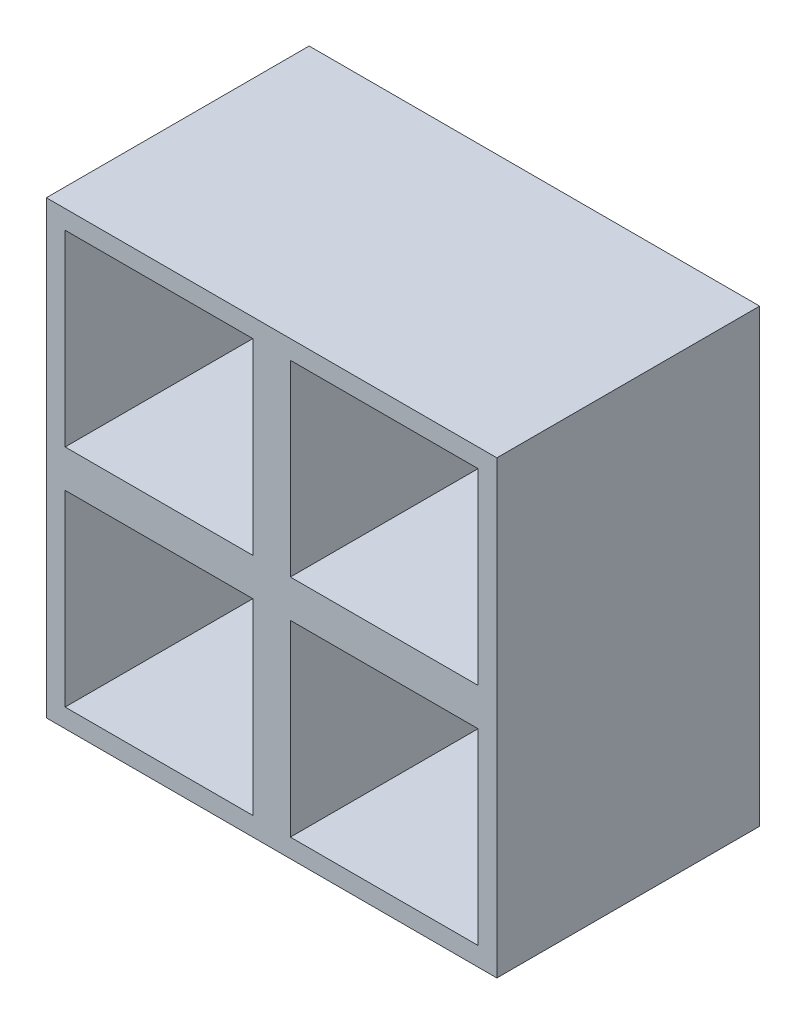
ISO-10303-21;
HEADER;
FILE_DESCRIPTION(('STEP AP214'),'2;1');
FILE_NAME('part.step','',(''),(''),'','','');
FILE_SCHEMA(('AUTOMOTIVE_DESIGN { 1 0 10303 214 1 1 1 1 }'));
ENDSEC;
DATA;
#1=APPLICATION_CONTEXT('core data for automotive mechanical design processes');
#2=APPLICATION_PROTOCOL_DEFINITION('international standard','automotive_design',2000,#1);
#3=PRODUCT_CONTEXT('',#1,'mechanical');
#4=PRODUCT('Part','Part','',(#3));
#5=PRODUCT_RELATED_PRODUCT_CATEGORY('part','',(#4));
#6=PRODUCT_DEFINITION_FORMATION('','',#4);
#7=PRODUCT_DEFINITION_CONTEXT('part definition',#1,'design');
#8=PRODUCT_DEFINITION('design','',#6,#7);
#9=PRODUCT_DEFINITION_SHAPE('','',#8);
#10=(LENGTH_UNIT() NAMED_UNIT(*) SI_UNIT(.MILLI.,.METRE.));
#11=(NAMED_UNIT(*) PLANE_ANGLE_UNIT() SI_UNIT($,.RADIAN.));
#12=(NAMED_UNIT(*) SI_UNIT($,.STERADIAN.) SOLID_ANGLE_UNIT());
#13=UNCERTAINTY_MEASURE_WITH_UNIT(LENGTH_MEASURE(1.E-05),#10,'distance_accuracy_value','');
#14=(GEOMETRIC_REPRESENTATION_CONTEXT(3) GLOBAL_UNCERTAINTY_ASSIGNED_CONTEXT((#13)) GLOBAL_UNIT_ASSIGNED_CONTEXT((#10,
#11,#12)) REPRESENTATION_CONTEXT('',''));
#15=CARTESIAN_POINT('',(0.,0.,0.));
#16=DIRECTION('',(0.,0.,1.));
#17=DIRECTION('',(1.,0.,0.));
#18=AXIS2_PLACEMENT_3D('',#15,#16,#17);
#19=CARTESIAN_POINT('',(-3.,-3.,1.));
#20=DIRECTION('',(1.,0.,0.));
#21=DIRECTION('',(0.,0.,-1.));
#22=AXIS2_PLACEMENT_3D('',#19,#20,#21);
#23=PLANE('',#22);
#24=DIRECTION('',(0.,-1.,0.));
#25=VECTOR('',#24,1.);
#26=CARTESIAN_POINT('',(-3.,-3.,0.));
#27=LINE('',#26,#25);
#28=CARTESIAN_POINT('',(-3.,3.,0.));
#29=VERTEX_POINT('',#28);
#30=CARTESIAN_POINT('',(-3.,-3.,0.));
#31=VERTEX_POINT('',#30);
#32=EDGE_CURVE('E295',#29,#31,#27,.T.);
#33=ORIENTED_EDGE('',*,*,#32,.T.);
#34=DIRECTION('',(0.,0.,-1.));
#35=VECTOR('',#34,1.);
#36=CARTESIAN_POINT('',(-3.,-3.,1.));
#37=LINE('',#36,#35);
#38=CARTESIAN_POINT('',(-3.,-3.,3.5));
#39=VERTEX_POINT('',#38);
#40=EDGE_CURVE('E11',#39,#31,#37,.T.);
#41=ORIENTED_EDGE('',*,*,#40,.F.);
#42=DIRECTION('',(0.,1.,0.));
#43=VECTOR('',#42,1.);
#44=CARTESIAN_POINT('',(-3.,0.,3.5));
#45=LINE('',#44,#43);
#46=CARTESIAN_POINT('',(-3.,3.,3.5));
#47=VERTEX_POINT('',#46);
#48=EDGE_CURVE('E219',#39,#47,#45,.T.);
#49=ORIENTED_EDGE('',*,*,#48,.T.);
#50=DIRECTION('',(0.,0.,-1.));
#51=VECTOR('',#50,1.);
#52=CARTESIAN_POINT('',(-3.,3.,1.));
#53=LINE('',#52,#51);
#54=EDGE_CURVE('E325',#47,#29,#53,.T.);
#55=ORIENTED_EDGE('',*,*,#54,.T.);
#56=EDGE_LOOP('',(#33,#41,#49,#55));
#57=FACE_BOUND('',#56,.T.);
#58=ADVANCED_FACE('F35',(#57),#23,.F.);
#59=CARTESIAN_POINT('',(3.,-3.,1.));
#60=DIRECTION('',(0.,1.,0.));
#61=DIRECTION('',(-1.,0.,0.));
#62=AXIS2_PLACEMENT_3D('',#59,#60,#61);
#63=PLANE('',#62);
#64=DIRECTION('',(1.,0.,0.));
#65=VECTOR('',#64,1.);
#66=CARTESIAN_POINT('',(3.,-3.,0.));
#67=LINE('',#66,#65);
#68=CARTESIAN_POINT('',(3.,-3.,0.));
#69=VERTEX_POINT('',#68);
#70=EDGE_CURVE('E319',#31,#69,#67,.T.);
#71=ORIENTED_EDGE('',*,*,#70,.T.);
#72=DIRECTION('',(0.,0.,-1.));
#73=VECTOR('',#72,1.);
#74=CARTESIAN_POINT('',(3.,-3.,1.));
#75=LINE('',#74,#73);
#76=CARTESIAN_POINT('',(3.,-3.,3.5));
#77=VERTEX_POINT('',#76);
#78=EDGE_CURVE('E42',#77,#69,#75,.T.);
#79=ORIENTED_EDGE('',*,*,#78,.F.);
#80=DIRECTION('',(-1.,0.,0.));
#81=VECTOR('',#80,1.);
#82=CARTESIAN_POINT('',(0.,-3.,3.5));
#83=LINE('',#82,#81);
#84=EDGE_CURVE('E222',#77,#39,#83,.T.);
#85=ORIENTED_EDGE('',*,*,#84,.T.);
#86=ORIENTED_EDGE('',*,*,#40,.T.);
#87=EDGE_LOOP('',(#71,#79,#85,#86));
#88=FACE_BOUND('',#87,.T.);
#89=ADVANCED_FACE('F348',(#88),#63,.F.);
#90=CARTESIAN_POINT('',(3.,-3.,1.));
#91=DIRECTION('',(-1.,0.,0.));
#92=DIRECTION('',(0.,0.,1.));
#93=AXIS2_PLACEMENT_3D('',#90,#91,#92);
#94=PLANE('',#93);
#95=DIRECTION('',(0.,1.,0.));
#96=VECTOR('',#95,1.);
#97=CARTESIAN_POINT('',(3.,-3.,0.));
#98=LINE('',#97,#96);
#99=CARTESIAN_POINT('',(3.,3.,0.));
#100=VERTEX_POINT('',#99);
#101=EDGE_CURVE('E321',#69,#100,#98,.T.);
#102=ORIENTED_EDGE('',*,*,#101,.T.);
#103=DIRECTION('',(0.,0.,-1.));
#104=VECTOR('',#103,1.);
#105=CARTESIAN_POINT('',(3.,3.,1.));
#106=LINE('',#105,#104);
#107=CARTESIAN_POINT('',(3.,3.,3.5));
#108=VERTEX_POINT('',#107);
#109=EDGE_CURVE('E328',#108,#100,#106,.T.);
#110=ORIENTED_EDGE('',*,*,#109,.F.);
#111=DIRECTION('',(0.,1.,0.));
#112=VECTOR('',#111,1.);
#113=CARTESIAN_POINT('',(3.,0.,3.5));
#114=LINE('',#113,#112);
#115=EDGE_CURVE('E213',#77,#108,#114,.T.);
#116=ORIENTED_EDGE('',*,*,#115,.F.);
#117=ORIENTED_EDGE('',*,*,#78,.T.);
#118=EDGE_LOOP('',(#102,#110,#116,#117));
#119=FACE_BOUND('',#118,.T.);
#120=ADVANCED_FACE('F334',(#119),#94,.F.);
#121=CARTESIAN_POINT('',(3.,3.,1.));
#122=DIRECTION('',(0.,-1.,0.));
#123=DIRECTION('',(1.,0.,0.));
#124=AXIS2_PLACEMENT_3D('',#121,#122,#123);
#125=PLANE('',#124);
#126=DIRECTION('',(-1.,0.,0.));
#127=VECTOR('',#126,1.);
#128=CARTESIAN_POINT('',(3.,3.,0.));
#129=LINE('',#128,#127);
#130=EDGE_CURVE('E323',#100,#29,#129,.T.);
#131=ORIENTED_EDGE('',*,*,#130,.T.);
#132=ORIENTED_EDGE('',*,*,#54,.F.);
#133=DIRECTION('',(-1.,0.,0.));
#134=VECTOR('',#133,1.);
#135=CARTESIAN_POINT('',(0.,3.,3.5));
#136=LINE('',#135,#134);
#137=EDGE_CURVE('E216',#108,#47,#136,.T.);
#138=ORIENTED_EDGE('',*,*,#137,.F.);
#139=ORIENTED_EDGE('',*,*,#109,.T.);
#140=EDGE_LOOP('',(#131,#132,#138,#139));
#141=FACE_BOUND('',#140,.T.);
#142=ADVANCED_FACE('F342',(#141),#125,.F.);
#143=CARTESIAN_POINT('',(0.,0.,0.));
#144=DIRECTION('',(0.,0.,1.));
#145=DIRECTION('',(1.,0.,0.));
#146=AXIS2_PLACEMENT_3D('',#143,#144,#145);
#147=PLANE('',#146);
#148=ORIENTED_EDGE('',*,*,#32,.F.);
#149=ORIENTED_EDGE('',*,*,#130,.F.);
#150=ORIENTED_EDGE('',*,*,#101,.F.);
#151=ORIENTED_EDGE('',*,*,#70,.F.);
#152=EDGE_LOOP('',(#148,#149,#150,#151));
#153=FACE_BOUND('',#152,.T.);
#154=ADVANCED_FACE('F340',(#153),#147,.F.);
#155=CARTESIAN_POINT('',(0.25,0.,3.5));
#156=DIRECTION('',(1.,0.,0.));
#157=DIRECTION('',(0.,1.,0.));
#158=AXIS2_PLACEMENT_3D('',#155,#156,#157);
#159=PLANE('',#158);
#160=DIRECTION('',(0.,-1.,0.));
#161=VECTOR('',#160,1.);
#162=CARTESIAN_POINT('',(0.25,0.,1.));
#163=LINE('',#162,#161);
#164=CARTESIAN_POINT('',(0.25,2.75,1.));
#165=VERTEX_POINT('',#164);
#166=CARTESIAN_POINT('',(0.25,0.25,1.));
#167=VERTEX_POINT('',#166);
#168=EDGE_CURVE('E276',#165,#167,#163,.T.);
#169=ORIENTED_EDGE('',*,*,#168,.F.);
#170=DIRECTION('',(0.,0.,-1.));
#171=VECTOR('',#170,1.);
#172=CARTESIAN_POINT('',(0.25,2.75,3.5));
#173=LINE('',#172,#171);
#174=CARTESIAN_POINT('',(0.25,2.75,3.5));
#175=VERTEX_POINT('',#174);
#176=EDGE_CURVE('E292',#175,#165,#173,.T.);
#177=ORIENTED_EDGE('',*,*,#176,.F.);
#178=DIRECTION('',(0.,-1.,0.));
#179=VECTOR('',#178,1.);
#180=CARTESIAN_POINT('',(0.25,0.,3.5));
#181=LINE('',#180,#179);
#182=CARTESIAN_POINT('',(0.25,0.25,3.5));
#183=VERTEX_POINT('',#182);
#184=EDGE_CURVE('E236',#175,#183,#181,.T.);
#185=ORIENTED_EDGE('',*,*,#184,.T.);
#186=DIRECTION('',(0.,0.,-1.));
#187=VECTOR('',#186,1.);
#188=CARTESIAN_POINT('',(0.25,0.25,3.5));
#189=LINE('',#188,#187);
#190=EDGE_CURVE('E282',#183,#167,#189,.T.);
#191=ORIENTED_EDGE('',*,*,#190,.T.);
#192=EDGE_LOOP('',(#169,#177,#185,#191));
#193=FACE_BOUND('',#192,.T.);
#194=ADVANCED_FACE('F360',(#193),#159,.T.);
#195=CARTESIAN_POINT('',(0.,2.75,3.5));
#196=DIRECTION('',(0.,1.,0.));
#197=DIRECTION('',(0.,0.,1.));
#198=AXIS2_PLACEMENT_3D('',#195,#196,#197);
#199=PLANE('',#198);
#200=DIRECTION('',(1.,0.,0.));
#201=VECTOR('',#200,1.);
#202=CARTESIAN_POINT('',(0.,2.75,1.));
#203=LINE('',#202,#201);
#204=CARTESIAN_POINT('',(2.75,2.75,1.));
#205=VERTEX_POINT('',#204);
#206=EDGE_CURVE('E278',#165,#205,#203,.T.);
#207=ORIENTED_EDGE('',*,*,#206,.T.);
#208=DIRECTION('',(0.,0.,-1.));
#209=VECTOR('',#208,1.);
#210=CARTESIAN_POINT('',(2.75,2.75,3.5));
#211=LINE('',#210,#209);
#212=CARTESIAN_POINT('',(2.75,2.75,3.5));
#213=VERTEX_POINT('',#212);
#214=EDGE_CURVE('E289',#213,#205,#211,.T.);
#215=ORIENTED_EDGE('',*,*,#214,.F.);
#216=DIRECTION('',(1.,0.,0.));
#217=VECTOR('',#216,1.);
#218=CARTESIAN_POINT('',(0.,2.75,3.5));
#219=LINE('',#218,#217);
#220=EDGE_CURVE('E239',#175,#213,#219,.T.);
#221=ORIENTED_EDGE('',*,*,#220,.F.);
#222=ORIENTED_EDGE('',*,*,#176,.T.);
#223=EDGE_LOOP('',(#207,#215,#221,#222));
#224=FACE_BOUND('',#223,.T.);
#225=ADVANCED_FACE('F415',(#224),#199,.F.);
#226=CARTESIAN_POINT('',(2.75,0.,3.5));
#227=DIRECTION('',(-1.,0.,0.));
#228=DIRECTION('',(0.,0.,1.));
#229=AXIS2_PLACEMENT_3D('',#226,#227,#228);
#230=PLANE('',#229);
#231=DIRECTION('',(0.,1.,0.));
#232=VECTOR('',#231,1.);
#233=CARTESIAN_POINT('',(2.75,0.,1.));
#234=LINE('',#233,#232);
#235=CARTESIAN_POINT('',(2.75,0.25,1.));
#236=VERTEX_POINT('',#235);
#237=EDGE_CURVE('E197',#236,#205,#234,.T.);
#238=ORIENTED_EDGE('',*,*,#237,.F.);
#239=DIRECTION('',(0.,0.,-1.));
#240=VECTOR('',#239,1.);
#241=CARTESIAN_POINT('',(2.75,0.25,3.5));
#242=LINE('',#241,#240);
#243=CARTESIAN_POINT('',(2.75,0.25,3.5));
#244=VERTEX_POINT('',#243);
#245=EDGE_CURVE('E285',#244,#236,#242,.T.);
#246=ORIENTED_EDGE('',*,*,#245,.F.);
#247=DIRECTION('',(0.,1.,0.));
#248=VECTOR('',#247,1.);
#249=CARTESIAN_POINT('',(2.75,0.,3.5));
#250=LINE('',#249,#248);
#251=EDGE_CURVE('E241',#244,#213,#250,.T.);
#252=ORIENTED_EDGE('',*,*,#251,.T.);
#253=ORIENTED_EDGE('',*,*,#214,.T.);
#254=EDGE_LOOP('',(#238,#246,#252,#253));
#255=FACE_BOUND('',#254,.T.);
#256=ADVANCED_FACE('F402',(#255),#230,.T.);
#257=CARTESIAN_POINT('',(0.,0.25,3.5));
#258=DIRECTION('',(0.,-1.,0.));
#259=DIRECTION('',(1.,0.,0.));
#260=AXIS2_PLACEMENT_3D('',#257,#258,#259);
#261=PLANE('',#260);
#262=DIRECTION('',(-1.,0.,0.));
#263=VECTOR('',#262,1.);
#264=CARTESIAN_POINT('',(0.,0.25,1.));
#265=LINE('',#264,#263);
#266=CARTESIAN_POINT('',(-0.25,0.25,1.));
#267=VERTEX_POINT('',#266);
#268=CARTESIAN_POINT('',(-2.75,0.25,1.));
#269=VERTEX_POINT('',#268);
#270=EDGE_CURVE('E269',#267,#269,#265,.T.);
#271=ORIENTED_EDGE('',*,*,#270,.T.);
#272=DIRECTION('',(0.,0.,-1.));
#273=VECTOR('',#272,1.);
#274=CARTESIAN_POINT('',(-2.75,0.25,3.5));
#275=LINE('',#274,#273);
#276=CARTESIAN_POINT('',(-2.75,0.25,3.5));
#277=VERTEX_POINT('',#276);
#278=EDGE_CURVE('E286',#277,#269,#275,.T.);
#279=ORIENTED_EDGE('',*,*,#278,.F.);
#280=DIRECTION('',(-1.,0.,0.));
#281=VECTOR('',#280,1.);
#282=CARTESIAN_POINT('',(0.,0.25,3.5));
#283=LINE('',#282,#281);
#284=CARTESIAN_POINT('',(-0.25,0.25,3.5));
#285=VERTEX_POINT('',#284);
#286=EDGE_CURVE('E225',#285,#277,#283,.T.);
#287=ORIENTED_EDGE('',*,*,#286,.F.);
#288=DIRECTION('',(0.,0.,-1.));
#289=VECTOR('',#288,1.);
#290=CARTESIAN_POINT('',(-0.25,0.25,3.5));
#291=LINE('',#290,#289);
#292=EDGE_CURVE('E296',#285,#267,#291,.T.);
#293=ORIENTED_EDGE('',*,*,#292,.T.);
#294=EDGE_LOOP('',(#271,#279,#287,#293));
#295=FACE_BOUND('',#294,.T.);
#296=ADVANCED_FACE('F398',(#295),#261,.F.);
#297=CARTESIAN_POINT('',(-2.75,0.,3.5));
#298=DIRECTION('',(-1.,0.,0.));
#299=DIRECTION('',(0.,0.,1.));
#300=AXIS2_PLACEMENT_3D('',#297,#298,#299);
#301=PLANE('',#300);
#302=DIRECTION('',(0.,1.,0.));
#303=VECTOR('',#302,1.);
#304=CARTESIAN_POINT('',(-2.75,0.,1.));
#305=LINE('',#304,#303);
#306=CARTESIAN_POINT('',(-2.75,2.75,1.));
#307=VERTEX_POINT('',#306);
#308=EDGE_CURVE('E49',#269,#307,#305,.T.);
#309=ORIENTED_EDGE('',*,*,#308,.T.);
#310=DIRECTION('',(0.,0.,-1.));
#311=VECTOR('',#310,1.);
#312=CARTESIAN_POINT('',(-2.75,2.75,3.5));
#313=LINE('',#312,#311);
#314=CARTESIAN_POINT('',(-2.75,2.75,3.5));
#315=VERTEX_POINT('',#314);
#316=EDGE_CURVE('E303',#315,#307,#313,.T.);
#317=ORIENTED_EDGE('',*,*,#316,.F.);
#318=DIRECTION('',(0.,1.,0.));
#319=VECTOR('',#318,1.);
#320=CARTESIAN_POINT('',(-2.75,0.,3.5));
#321=LINE('',#320,#319);
#322=EDGE_CURVE('E228',#277,#315,#321,.T.);
#323=ORIENTED_EDGE('',*,*,#322,.F.);
#324=ORIENTED_EDGE('',*,*,#278,.T.);
#325=EDGE_LOOP('',(#309,#317,#323,#324));
#326=FACE_BOUND('',#325,.T.);
#327=ADVANCED_FACE('F401',(#326),#301,.F.);
#328=CARTESIAN_POINT('',(0.,2.75,3.5));
#329=DIRECTION('',(0.,-1.,0.));
#330=DIRECTION('',(0.,0.,-1.));
#331=AXIS2_PLACEMENT_3D('',#328,#329,#330);
#332=PLANE('',#331);
#333=DIRECTION('',(-1.,0.,0.));
#334=VECTOR('',#333,1.);
#335=CARTESIAN_POINT('',(0.,2.75,1.));
#336=LINE('',#335,#334);
#337=CARTESIAN_POINT('',(-0.25,2.75,1.));
#338=VERTEX_POINT('',#337);
#339=EDGE_CURVE('E54',#338,#307,#336,.T.);
#340=ORIENTED_EDGE('',*,*,#339,.F.);
#341=DIRECTION('',(0.,0.,-1.));
#342=VECTOR('',#341,1.);
#343=CARTESIAN_POINT('',(-0.25,2.75,3.5));
#344=LINE('',#343,#342);
#345=CARTESIAN_POINT('',(-0.25,2.75,3.5));
#346=VERTEX_POINT('',#345);
#347=EDGE_CURVE('E299',#346,#338,#344,.T.);
#348=ORIENTED_EDGE('',*,*,#347,.F.);
#349=DIRECTION('',(-1.,0.,0.));
#350=VECTOR('',#349,1.);
#351=CARTESIAN_POINT('',(0.,2.75,3.5));
#352=LINE('',#351,#350);
#353=EDGE_CURVE('E230',#346,#315,#352,.T.);
#354=ORIENTED_EDGE('',*,*,#353,.T.);
#355=ORIENTED_EDGE('',*,*,#316,.T.);
#356=EDGE_LOOP('',(#340,#348,#354,#355));
#357=FACE_BOUND('',#356,.T.);
#358=ADVANCED_FACE('F387',(#357),#332,.T.);
#359=CARTESIAN_POINT('',(0.,-2.75,3.5));
#360=DIRECTION('',(0.,1.,0.));
#361=DIRECTION('',(0.,0.,1.));
#362=AXIS2_PLACEMENT_3D('',#359,#360,#361);
#363=PLANE('',#362);
#364=DIRECTION('',(1.,0.,0.));
#365=VECTOR('',#364,1.);
#366=CARTESIAN_POINT('',(0.,-2.75,1.));
#367=LINE('',#366,#365);
#368=CARTESIAN_POINT('',(0.25,-2.75,1.));
#369=VERTEX_POINT('',#368);
#370=CARTESIAN_POINT('',(2.75,-2.75,1.));
#371=VERTEX_POINT('',#370);
#372=EDGE_CURVE('E257',#369,#371,#367,.T.);
#373=ORIENTED_EDGE('',*,*,#372,.F.);
#374=DIRECTION('',(0.,0.,-1.));
#375=VECTOR('',#374,1.);
#376=CARTESIAN_POINT('',(0.25,-2.75,3.5));
#377=LINE('',#376,#375);
#378=CARTESIAN_POINT('',(0.25,-2.75,3.5));
#379=VERTEX_POINT('',#378);
#380=EDGE_CURVE('E300',#379,#369,#377,.T.);
#381=ORIENTED_EDGE('',*,*,#380,.F.);
#382=DIRECTION('',(1.,0.,0.));
#383=VECTOR('',#382,1.);
#384=CARTESIAN_POINT('',(0.,-2.75,3.5));
#385=LINE('',#384,#383);
#386=CARTESIAN_POINT('',(2.75,-2.75,3.5));
#387=VERTEX_POINT('',#386);
#388=EDGE_CURVE('E202',#379,#387,#385,.T.);
#389=ORIENTED_EDGE('',*,*,#388,.T.);
#390=DIRECTION('',(0.,0.,-1.));
#391=VECTOR('',#390,1.);
#392=CARTESIAN_POINT('',(2.75,-2.75,3.5));
#393=LINE('',#392,#391);
#394=EDGE_CURVE('E179',#387,#371,#393,.T.);
#395=ORIENTED_EDGE('',*,*,#394,.T.);
#396=EDGE_LOOP('',(#373,#381,#389,#395));
#397=FACE_BOUND('',#396,.T.);
#398=ADVANCED_FACE('F383',(#397),#363,.T.);
#399=CARTESIAN_POINT('',(0.250000000000001,0.,3.5));
#400=DIRECTION('',(1.,0.,0.));
#401=DIRECTION('',(0.,1.,0.));
#402=AXIS2_PLACEMENT_3D('',#399,#400,#401);
#403=PLANE('',#402);
#404=DIRECTION('',(0.,-1.,0.));
#405=VECTOR('',#404,1.);
#406=CARTESIAN_POINT('',(0.250000000000001,0.,1.));
#407=LINE('',#406,#405);
#408=CARTESIAN_POINT('',(0.250000000000001,-0.250000000000001,1.));
#409=VERTEX_POINT('',#408);
#410=EDGE_CURVE('E260',#409,#369,#407,.T.);
#411=ORIENTED_EDGE('',*,*,#410,.F.);
#412=DIRECTION('',(0.,0.,-1.));
#413=VECTOR('',#412,1.);
#414=CARTESIAN_POINT('',(0.250000000000001,-0.250000000000001,3.5));
#415=LINE('',#414,#413);
#416=CARTESIAN_POINT('',(0.250000000000001,-0.250000000000001,3.5));
#417=VERTEX_POINT('',#416);
#418=EDGE_CURVE('E310',#417,#409,#415,.T.);
#419=ORIENTED_EDGE('',*,*,#418,.F.);
#420=DIRECTION('',(0.,-1.,0.));
#421=VECTOR('',#420,1.);
#422=CARTESIAN_POINT('',(0.250000000000001,0.,3.5));
#423=LINE('',#422,#421);
#424=EDGE_CURVE('E205',#417,#379,#423,.T.);
#425=ORIENTED_EDGE('',*,*,#424,.T.);
#426=ORIENTED_EDGE('',*,*,#380,.T.);
#427=EDGE_LOOP('',(#411,#419,#425,#426));
#428=FACE_BOUND('',#427,.T.);
#429=ADVANCED_FACE('F386',(#428),#403,.T.);
#430=CARTESIAN_POINT('',(0.,-0.250000000000001,3.5));
#431=DIRECTION('',(0.,-1.,0.));
#432=DIRECTION('',(1.,0.,0.));
#433=AXIS2_PLACEMENT_3D('',#430,#431,#432);
#434=PLANE('',#433);
#435=DIRECTION('',(-1.,0.,0.));
#436=VECTOR('',#435,1.);
#437=CARTESIAN_POINT('',(0.,-0.250000000000001,1.));
#438=LINE('',#437,#436);
#439=CARTESIAN_POINT('',(2.75,-0.25,1.));
#440=VERTEX_POINT('',#439);
#441=EDGE_CURVE('E263',#440,#409,#438,.T.);
#442=ORIENTED_EDGE('',*,*,#441,.F.);
#443=DIRECTION('',(0.,0.,-1.));
#444=VECTOR('',#443,1.);
#445=CARTESIAN_POINT('',(2.75,-0.25,3.5));
#446=LINE('',#445,#444);
#447=CARTESIAN_POINT('',(2.75,-0.25,3.5));
#448=VERTEX_POINT('',#447);
#449=EDGE_CURVE('E307',#448,#440,#446,.T.);
#450=ORIENTED_EDGE('',*,*,#449,.F.);
#451=DIRECTION('',(-1.,0.,0.));
#452=VECTOR('',#451,1.);
#453=CARTESIAN_POINT('',(0.,-0.250000000000001,3.5));
#454=LINE('',#453,#452);
#455=EDGE_CURVE('E208',#448,#417,#454,.T.);
#456=ORIENTED_EDGE('',*,*,#455,.T.);
#457=ORIENTED_EDGE('',*,*,#418,.T.);
#458=EDGE_LOOP('',(#442,#450,#456,#457));
#459=FACE_BOUND('',#458,.T.);
#460=ADVANCED_FACE('F369',(#459),#434,.T.);
#461=CARTESIAN_POINT('',(-2.75,0.,3.5));
#462=DIRECTION('',(1.,0.,0.));
#463=DIRECTION('',(0.,0.,-1.));
#464=AXIS2_PLACEMENT_3D('',#461,#462,#463);
#465=PLANE('',#464);
#466=DIRECTION('',(0.,-1.,0.));
#467=VECTOR('',#466,1.);
#468=CARTESIAN_POINT('',(-2.75,0.,1.));
#469=LINE('',#468,#467);
#470=CARTESIAN_POINT('',(-2.75,-0.25,1.));
#471=VERTEX_POINT('',#470);
#472=CARTESIAN_POINT('',(-2.75,-2.75,1.));
#473=VERTEX_POINT('',#472);
#474=EDGE_CURVE('E176',#471,#473,#469,.T.);
#475=ORIENTED_EDGE('',*,*,#474,.F.);
#476=DIRECTION('',(0.,0.,-1.));
#477=VECTOR('',#476,1.);
#478=CARTESIAN_POINT('',(-2.75,-0.25,3.5));
#479=LINE('',#478,#477);
#480=CARTESIAN_POINT('',(-2.75,-0.25,3.5));
#481=VERTEX_POINT('',#480);
#482=EDGE_CURVE('E170',#481,#471,#479,.T.);
#483=ORIENTED_EDGE('',*,*,#482,.F.);
#484=DIRECTION('',(0.,-1.,0.));
#485=VECTOR('',#484,1.);
#486=CARTESIAN_POINT('',(-2.75,0.,3.5));
#487=LINE('',#486,#485);
#488=CARTESIAN_POINT('',(-2.75,-2.75,3.5));
#489=VERTEX_POINT('',#488);
#490=EDGE_CURVE('E174',#481,#489,#487,.T.);
#491=ORIENTED_EDGE('',*,*,#490,.T.);
#492=DIRECTION('',(0.,0.,-1.));
#493=VECTOR('',#492,1.);
#494=CARTESIAN_POINT('',(-2.75,-2.75,3.5));
#495=LINE('',#494,#493);
#496=EDGE_CURVE('E247',#489,#473,#495,.T.);
#497=ORIENTED_EDGE('',*,*,#496,.T.);
#498=EDGE_LOOP('',(#475,#483,#491,#497));
#499=FACE_BOUND('',#498,.T.);
#500=ADVANCED_FACE('F172',(#499),#465,.T.);
#501=CARTESIAN_POINT('',(0.,-0.250000000000001,3.5));
#502=DIRECTION('',(0.,1.,0.));
#503=DIRECTION('',(-1.,0.,0.));
#504=AXIS2_PLACEMENT_3D('',#501,#502,#503);
#505=PLANE('',#504);
#506=DIRECTION('',(1.,0.,0.));
#507=VECTOR('',#506,1.);
#508=CARTESIAN_POINT('',(0.,-0.250000000000001,1.));
#509=LINE('',#508,#507);
#510=CARTESIAN_POINT('',(-0.250000000000001,-0.250000000000001,1.));
#511=VERTEX_POINT('',#510);
#512=EDGE_CURVE('E249',#471,#511,#509,.T.);
#513=ORIENTED_EDGE('',*,*,#512,.T.);
#514=DIRECTION('',(0.,0.,-1.));
#515=VECTOR('',#514,1.);
#516=CARTESIAN_POINT('',(-0.250000000000001,-0.250000000000001,3.5));
#517=LINE('',#516,#515);
#518=CARTESIAN_POINT('',(-0.250000000000001,-0.250000000000001,3.5));
#519=VERTEX_POINT('',#518);
#520=EDGE_CURVE('E180',#519,#511,#517,.T.);
#521=ORIENTED_EDGE('',*,*,#520,.F.);
#522=DIRECTION('',(1.,0.,0.));
#523=VECTOR('',#522,1.);
#524=CARTESIAN_POINT('',(0.,-0.250000000000001,3.5));
#525=LINE('',#524,#523);
#526=EDGE_CURVE('E183',#481,#519,#525,.T.);
#527=ORIENTED_EDGE('',*,*,#526,.F.);
#528=ORIENTED_EDGE('',*,*,#482,.T.);
#529=EDGE_LOOP('',(#513,#521,#527,#528));
#530=FACE_BOUND('',#529,.T.);
#531=ADVANCED_FACE('F184',(#530),#505,.F.);
#532=CARTESIAN_POINT('',(-0.250000000000001,0.,3.5));
#533=DIRECTION('',(1.,0.,0.));
#534=DIRECTION('',(0.,1.,0.));
#535=AXIS2_PLACEMENT_3D('',#532,#533,#534);
#536=PLANE('',#535);
#537=DIRECTION('',(0.,-1.,0.));
#538=VECTOR('',#537,1.);
#539=CARTESIAN_POINT('',(-0.250000000000001,0.,1.));
#540=LINE('',#539,#538);
#541=CARTESIAN_POINT('',(-0.25,-2.75,1.));
#542=VERTEX_POINT('',#541);
#543=EDGE_CURVE('E251',#511,#542,#540,.T.);
#544=ORIENTED_EDGE('',*,*,#543,.T.);
#545=DIRECTION('',(0.,0.,-1.));
#546=VECTOR('',#545,1.);
#547=CARTESIAN_POINT('',(-0.25,-2.75,3.5));
#548=LINE('',#547,#546);
#549=CARTESIAN_POINT('',(-0.25,-2.75,3.5));
#550=VERTEX_POINT('',#549);
#551=EDGE_CURVE('E314',#550,#542,#548,.T.);
#552=ORIENTED_EDGE('',*,*,#551,.F.);
#553=DIRECTION('',(0.,-1.,0.));
#554=VECTOR('',#553,1.);
#555=CARTESIAN_POINT('',(-0.250000000000001,0.,3.5));
#556=LINE('',#555,#554);
#557=EDGE_CURVE('E188',#519,#550,#556,.T.);
#558=ORIENTED_EDGE('',*,*,#557,.F.);
#559=ORIENTED_EDGE('',*,*,#520,.T.);
#560=EDGE_LOOP('',(#544,#552,#558,#559));
#561=FACE_BOUND('',#560,.T.);
#562=ADVANCED_FACE('F372',(#561),#536,.F.);
#563=CARTESIAN_POINT('',(-0.25,0.,3.5));
#564=DIRECTION('',(-1.,0.,0.));
#565=DIRECTION('',(0.,-1.,0.));
#566=AXIS2_PLACEMENT_3D('',#563,#564,#565);
#567=PLANE('',#566);
#568=DIRECTION('',(0.,1.,0.));
#569=VECTOR('',#568,1.);
#570=CARTESIAN_POINT('',(-0.25,0.,1.));
#571=LINE('',#570,#569);
#572=EDGE_CURVE('E274',#267,#338,#571,.T.);
#573=ORIENTED_EDGE('',*,*,#572,.F.);
#574=ORIENTED_EDGE('',*,*,#292,.F.);
#575=DIRECTION('',(0.,1.,0.));
#576=VECTOR('',#575,1.);
#577=CARTESIAN_POINT('',(-0.25,0.,3.5));
#578=LINE('',#577,#576);
#579=EDGE_CURVE('E233',#285,#346,#578,.T.);
#580=ORIENTED_EDGE('',*,*,#579,.T.);
#581=ORIENTED_EDGE('',*,*,#347,.T.);
#582=EDGE_LOOP('',(#573,#574,#580,#581));
#583=FACE_BOUND('',#582,.T.);
#584=ADVANCED_FACE('F375',(#583),#567,.T.);
#585=CARTESIAN_POINT('',(2.75,0.,3.5));
#586=DIRECTION('',(1.,0.,0.));
#587=DIRECTION('',(0.,0.,-1.));
#588=AXIS2_PLACEMENT_3D('',#585,#586,#587);
#589=PLANE('',#588);
#590=DIRECTION('',(0.,-1.,0.));
#591=VECTOR('',#590,1.);
#592=CARTESIAN_POINT('',(2.75,0.,1.));
#593=LINE('',#592,#591);
#594=EDGE_CURVE('E266',#440,#371,#593,.T.);
#595=ORIENTED_EDGE('',*,*,#594,.T.);
#596=ORIENTED_EDGE('',*,*,#394,.F.);
#597=DIRECTION('',(0.,-1.,0.));
#598=VECTOR('',#597,1.);
#599=CARTESIAN_POINT('',(2.75,0.,3.5));
#600=LINE('',#599,#598);
#601=EDGE_CURVE('E211',#448,#387,#600,.T.);
#602=ORIENTED_EDGE('',*,*,#601,.F.);
#603=ORIENTED_EDGE('',*,*,#449,.T.);
#604=EDGE_LOOP('',(#595,#596,#602,#603));
#605=FACE_BOUND('',#604,.T.);
#606=ADVANCED_FACE('F381',(#605),#589,.F.);
#607=CARTESIAN_POINT('',(0.,-2.75,3.5));
#608=DIRECTION('',(0.,-1.,0.));
#609=DIRECTION('',(0.,0.,-1.));
#610=AXIS2_PLACEMENT_3D('',#607,#608,#609);
#611=PLANE('',#610);
#612=DIRECTION('',(-1.,0.,0.));
#613=VECTOR('',#612,1.);
#614=CARTESIAN_POINT('',(0.,-2.75,1.));
#615=LINE('',#614,#613);
#616=EDGE_CURVE('E254',#542,#473,#615,.T.);
#617=ORIENTED_EDGE('',*,*,#616,.T.);
#618=ORIENTED_EDGE('',*,*,#496,.F.);
#619=DIRECTION('',(-1.,0.,0.));
#620=VECTOR('',#619,1.);
#621=CARTESIAN_POINT('',(0.,-2.75,3.5));
#622=LINE('',#621,#620);
#623=EDGE_CURVE('E193',#550,#489,#622,.T.);
#624=ORIENTED_EDGE('',*,*,#623,.F.);
#625=ORIENTED_EDGE('',*,*,#551,.T.);
#626=EDGE_LOOP('',(#617,#618,#624,#625));
#627=FACE_BOUND('',#626,.T.);
#628=ADVANCED_FACE('F377',(#627),#611,.F.);
#629=CARTESIAN_POINT('',(0.,0.25,3.5));
#630=DIRECTION('',(0.,1.,0.));
#631=DIRECTION('',(-1.,0.,0.));
#632=AXIS2_PLACEMENT_3D('',#629,#630,#631);
#633=PLANE('',#632);
#634=DIRECTION('',(1.,0.,0.));
#635=VECTOR('',#634,1.);
#636=CARTESIAN_POINT('',(0.,0.25,1.));
#637=LINE('',#636,#635);
#638=EDGE_CURVE('E195',#167,#236,#637,.T.);
#639=ORIENTED_EDGE('',*,*,#638,.F.);
#640=ORIENTED_EDGE('',*,*,#190,.F.);
#641=DIRECTION('',(1.,0.,0.));
#642=VECTOR('',#641,1.);
#643=CARTESIAN_POINT('',(0.,0.25,3.5));
#644=LINE('',#643,#642);
#645=EDGE_CURVE('E244',#183,#244,#644,.T.);
#646=ORIENTED_EDGE('',*,*,#645,.T.);
#647=ORIENTED_EDGE('',*,*,#245,.T.);
#648=EDGE_LOOP('',(#639,#640,#646,#647));
#649=FACE_BOUND('',#648,.T.);
#650=ADVANCED_FACE('F380',(#649),#633,.T.);
#651=CARTESIAN_POINT('',(0.,0.,3.5));
#652=DIRECTION('',(0.,0.,1.));
#653=DIRECTION('',(1.,0.,0.));
#654=AXIS2_PLACEMENT_3D('',#651,#652,#653);
#655=PLANE('',#654);
#656=ORIENTED_EDGE('',*,*,#490,.F.);
#657=ORIENTED_EDGE('',*,*,#526,.T.);
#658=ORIENTED_EDGE('',*,*,#557,.T.);
#659=ORIENTED_EDGE('',*,*,#623,.T.);
#660=EDGE_LOOP('',(#656,#657,#658,#659));
#661=FACE_BOUND('',#660,.T.);
#662=ORIENTED_EDGE('',*,*,#388,.F.);
#663=ORIENTED_EDGE('',*,*,#424,.F.);
#664=ORIENTED_EDGE('',*,*,#455,.F.);
#665=ORIENTED_EDGE('',*,*,#601,.T.);
#666=EDGE_LOOP('',(#662,#663,#664,#665));
#667=FACE_BOUND('',#666,.T.);
#668=ORIENTED_EDGE('',*,*,#115,.T.);
#669=ORIENTED_EDGE('',*,*,#137,.T.);
#670=ORIENTED_EDGE('',*,*,#48,.F.);
#671=ORIENTED_EDGE('',*,*,#84,.F.);
#672=EDGE_LOOP('',(#668,#669,#670,#671));
#673=FACE_BOUND('',#672,.T.);
#674=ORIENTED_EDGE('',*,*,#286,.T.);
#675=ORIENTED_EDGE('',*,*,#322,.T.);
#676=ORIENTED_EDGE('',*,*,#353,.F.);
#677=ORIENTED_EDGE('',*,*,#579,.F.);
#678=EDGE_LOOP('',(#674,#675,#676,#677));
#679=FACE_BOUND('',#678,.T.);
#680=ORIENTED_EDGE('',*,*,#184,.F.);
#681=ORIENTED_EDGE('',*,*,#220,.T.);
#682=ORIENTED_EDGE('',*,*,#251,.F.);
#683=ORIENTED_EDGE('',*,*,#645,.F.);
#684=EDGE_LOOP('',(#680,#681,#682,#683));
#685=FACE_BOUND('',#684,.T.);
#686=ADVANCED_FACE('F190',(#661,#667,#673,#679,#685),#655,.T.);
#687=CARTESIAN_POINT('',(0.,0.,1.));
#688=DIRECTION('',(0.,0.,1.));
#689=DIRECTION('',(1.,0.,0.));
#690=AXIS2_PLACEMENT_3D('',#687,#688,#689);
#691=PLANE('',#690);
#692=ORIENTED_EDGE('',*,*,#168,.T.);
#693=ORIENTED_EDGE('',*,*,#638,.T.);
#694=ORIENTED_EDGE('',*,*,#237,.T.);
#695=ORIENTED_EDGE('',*,*,#206,.F.);
#696=EDGE_LOOP('',(#692,#693,#694,#695));
#697=FACE_BOUND('',#696,.T.);
#698=ADVANCED_FACE('F361',(#697),#691,.T.);
#699=ORIENTED_EDGE('',*,*,#474,.T.);
#700=ORIENTED_EDGE('',*,*,#616,.F.);
#701=ORIENTED_EDGE('',*,*,#543,.F.);
#702=ORIENTED_EDGE('',*,*,#512,.F.);
#703=EDGE_LOOP('',(#699,#700,#701,#702));
#704=FACE_BOUND('',#703,.T.);
#705=ADVANCED_FACE('F364',(#704),#691,.T.);
#706=ORIENTED_EDGE('',*,*,#372,.T.);
#707=ORIENTED_EDGE('',*,*,#594,.F.);
#708=ORIENTED_EDGE('',*,*,#441,.T.);
#709=ORIENTED_EDGE('',*,*,#410,.T.);
#710=EDGE_LOOP('',(#706,#707,#708,#709));
#711=FACE_BOUND('',#710,.T.);
#712=ADVANCED_FACE('F441',(#711),#691,.T.);
#713=ORIENTED_EDGE('',*,*,#308,.F.);
#714=ORIENTED_EDGE('',*,*,#270,.F.);
#715=ORIENTED_EDGE('',*,*,#572,.T.);
#716=ORIENTED_EDGE('',*,*,#339,.T.);
#717=EDGE_LOOP('',(#713,#714,#715,#716));
#718=FACE_BOUND('',#717,.T.);
#719=ADVANCED_FACE('F366',(#718),#691,.T.);
#720=CLOSED_SHELL('',(#58,#89,#120,#142,#154,#194,#225,#256,#296,#327,#358,#398,#429,#460,#500,
#531,#562,#584,#606,#628,#650,#686,#698,#705,#712,#719));
#721=MANIFOLD_SOLID_BREP('B2',#720);
#722=ADVANCED_BREP_SHAPE_REPRESENTATION('',(#18,#721),#14);
#723=SHAPE_DEFINITION_REPRESENTATION(#9,#722);
ENDSEC;
END-ISO-10303-21;
